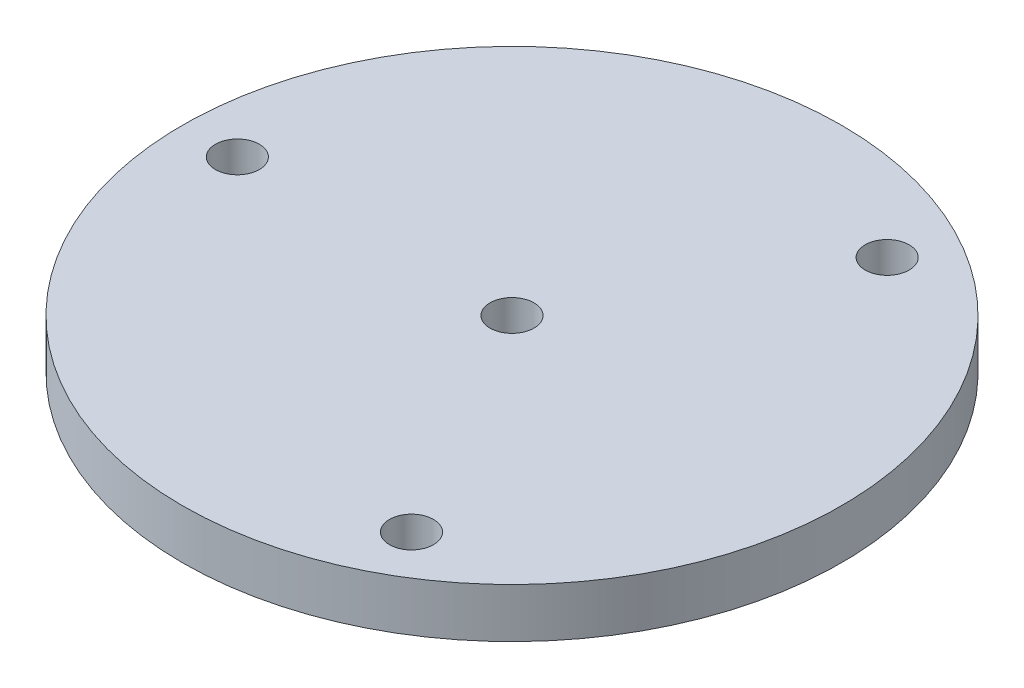
ISO-10303-21;
HEADER;
FILE_DESCRIPTION(('STEP AP214'),'2;1');
FILE_NAME('part.step','',(''),(''),'','','');
FILE_SCHEMA(('AUTOMOTIVE_DESIGN { 1 0 10303 214 1 1 1 1 }'));
ENDSEC;
DATA;
#1=APPLICATION_CONTEXT('core data for automotive mechanical design processes');
#2=APPLICATION_PROTOCOL_DEFINITION('international standard','automotive_design',2000,#1);
#3=PRODUCT_CONTEXT('',#1,'mechanical');
#4=PRODUCT('Part','Part','',(#3));
#5=PRODUCT_RELATED_PRODUCT_CATEGORY('part','',(#4));
#6=PRODUCT_DEFINITION_FORMATION('','',#4);
#7=PRODUCT_DEFINITION_CONTEXT('part definition',#1,'design');
#8=PRODUCT_DEFINITION('design','',#6,#7);
#9=PRODUCT_DEFINITION_SHAPE('','',#8);
#10=(LENGTH_UNIT() NAMED_UNIT(*) SI_UNIT(.MILLI.,.METRE.));
#11=(NAMED_UNIT(*) PLANE_ANGLE_UNIT() SI_UNIT($,.RADIAN.));
#12=(NAMED_UNIT(*) SI_UNIT($,.STERADIAN.) SOLID_ANGLE_UNIT());
#13=UNCERTAINTY_MEASURE_WITH_UNIT(LENGTH_MEASURE(1.E-05),#10,'distance_accuracy_value','');
#14=(GEOMETRIC_REPRESENTATION_CONTEXT(3) GLOBAL_UNCERTAINTY_ASSIGNED_CONTEXT((#13)) GLOBAL_UNIT_ASSIGNED_CONTEXT((#10,
#11,#12)) REPRESENTATION_CONTEXT('',''));
#15=CARTESIAN_POINT('',(0.,0.,0.));
#16=DIRECTION('',(0.,0.,1.));
#17=DIRECTION('',(1.,0.,0.));
#18=AXIS2_PLACEMENT_3D('',#15,#16,#17);
#19=CARTESIAN_POINT('',(0.,9.,0.));
#20=DIRECTION('',(0.,1.,0.));
#21=DIRECTION('',(0.,0.,1.));
#22=AXIS2_PLACEMENT_3D('',#19,#20,#21);
#23=PLANE('',#22);
#24=CARTESIAN_POINT('',(25.0000000000002,9.,-43.3012701892218));
#25=DIRECTION('',(0.,1.,0.));
#26=DIRECTION('',(0.,0.,1.));
#27=AXIS2_PLACEMENT_3D('',#24,#25,#26);
#28=CIRCLE('',#27,4.00000000000001);
#29=CARTESIAN_POINT('',(25.0000000000002,9.,-39.3012701892218));
#30=VERTEX_POINT('',#29);
#31=EDGE_CURVE('E64',#30,#30,#28,.T.);
#32=ORIENTED_EDGE('',*,*,#31,.F.);
#33=EDGE_LOOP('',(#32));
#34=FACE_BOUND('',#33,.T.);
#35=CARTESIAN_POINT('',(0.,9.,0.));
#36=DIRECTION('',(0.,1.,0.));
#37=DIRECTION('',(0.,0.,1.));
#38=AXIS2_PLACEMENT_3D('',#35,#36,#37);
#39=CIRCLE('',#38,4.);
#40=CARTESIAN_POINT('',(0.,9.,4.));
#41=VERTEX_POINT('',#40);
#42=EDGE_CURVE('E50',#41,#41,#39,.T.);
#43=ORIENTED_EDGE('',*,*,#42,.F.);
#44=EDGE_LOOP('',(#43));
#45=FACE_BOUND('',#44,.T.);
#46=CARTESIAN_POINT('',(0.,9.,0.));
#47=DIRECTION('',(0.,1.,0.));
#48=DIRECTION('',(0.,0.,1.));
#49=AXIS2_PLACEMENT_3D('',#46,#47,#48);
#50=CIRCLE('',#49,60.);
#51=CARTESIAN_POINT('',(0.,9.,60.));
#52=VERTEX_POINT('',#51);
#53=EDGE_CURVE('E10',#52,#52,#50,.T.);
#54=ORIENTED_EDGE('',*,*,#53,.T.);
#55=EDGE_LOOP('',(#54));
#56=FACE_BOUND('',#55,.T.);
#57=CARTESIAN_POINT('',(-50.,9.,0.));
#58=DIRECTION('',(0.,1.,0.));
#59=DIRECTION('',(0.,0.,1.));
#60=AXIS2_PLACEMENT_3D('',#57,#58,#59);
#61=CIRCLE('',#60,4.00000000000001);
#62=CARTESIAN_POINT('',(-50.,9.,4.00000000000001));
#63=VERTEX_POINT('',#62);
#64=EDGE_CURVE('E56',#63,#63,#61,.T.);
#65=ORIENTED_EDGE('',*,*,#64,.F.);
#66=EDGE_LOOP('',(#65));
#67=FACE_BOUND('',#66,.T.);
#68=CARTESIAN_POINT('',(24.9999999999996,9.,43.3012701892222));
#69=DIRECTION('',(0.,1.,0.));
#70=DIRECTION('',(0.,0.,1.));
#71=AXIS2_PLACEMENT_3D('',#68,#69,#70);
#72=CIRCLE('',#71,4.00000000000001);
#73=CARTESIAN_POINT('',(24.9999999999996,9.,47.3012701892222));
#74=VERTEX_POINT('',#73);
#75=EDGE_CURVE('E72',#74,#74,#72,.T.);
#76=ORIENTED_EDGE('',*,*,#75,.F.);
#77=EDGE_LOOP('',(#76));
#78=FACE_BOUND('',#77,.T.);
#79=ADVANCED_FACE('F37',(#34,#45,#56,#67,#78),#23,.T.);
#80=CARTESIAN_POINT('',(0.,0.,0.));
#81=DIRECTION('',(0.,1.,0.));
#82=DIRECTION('',(0.,0.,1.));
#83=AXIS2_PLACEMENT_3D('',#80,#81,#82);
#84=PLANE('',#83);
#85=CARTESIAN_POINT('',(0.,0.,0.));
#86=DIRECTION('',(0.,1.,0.));
#87=DIRECTION('',(0.,0.,1.));
#88=AXIS2_PLACEMENT_3D('',#85,#86,#87);
#89=CIRCLE('',#88,60.);
#90=CARTESIAN_POINT('',(0.,0.,60.));
#91=VERTEX_POINT('',#90);
#92=EDGE_CURVE('E41',#91,#91,#89,.T.);
#93=ORIENTED_EDGE('',*,*,#92,.F.);
#94=EDGE_LOOP('',(#93));
#95=FACE_BOUND('',#94,.T.);
#96=CARTESIAN_POINT('',(0.,0.,0.));
#97=DIRECTION('',(0.,1.,0.));
#98=DIRECTION('',(0.,0.,1.));
#99=AXIS2_PLACEMENT_3D('',#96,#97,#98);
#100=CIRCLE('',#99,4.);
#101=CARTESIAN_POINT('',(0.,0.,4.));
#102=VERTEX_POINT('',#101);
#103=EDGE_CURVE('E52',#102,#102,#100,.T.);
#104=ORIENTED_EDGE('',*,*,#103,.T.);
#105=EDGE_LOOP('',(#104));
#106=FACE_BOUND('',#105,.T.);
#107=CARTESIAN_POINT('',(-50.,0.,0.));
#108=DIRECTION('',(0.,1.,0.));
#109=DIRECTION('',(0.,0.,1.));
#110=AXIS2_PLACEMENT_3D('',#107,#108,#109);
#111=CIRCLE('',#110,4.00000000000001);
#112=CARTESIAN_POINT('',(-50.,0.,4.00000000000001));
#113=VERTEX_POINT('',#112);
#114=EDGE_CURVE('E60',#113,#113,#111,.T.);
#115=ORIENTED_EDGE('',*,*,#114,.T.);
#116=EDGE_LOOP('',(#115));
#117=FACE_BOUND('',#116,.T.);
#118=CARTESIAN_POINT('',(25.0000000000002,0.,-43.3012701892218));
#119=DIRECTION('',(0.,1.,0.));
#120=DIRECTION('',(0.,0.,1.));
#121=AXIS2_PLACEMENT_3D('',#118,#119,#120);
#122=CIRCLE('',#121,4.00000000000001);
#123=CARTESIAN_POINT('',(25.0000000000002,0.,-39.3012701892218));
#124=VERTEX_POINT('',#123);
#125=EDGE_CURVE('E68',#124,#124,#122,.T.);
#126=ORIENTED_EDGE('',*,*,#125,.T.);
#127=EDGE_LOOP('',(#126));
#128=FACE_BOUND('',#127,.T.);
#129=CARTESIAN_POINT('',(24.9999999999996,0.,43.3012701892222));
#130=DIRECTION('',(0.,1.,0.));
#131=DIRECTION('',(0.,0.,1.));
#132=AXIS2_PLACEMENT_3D('',#129,#130,#131);
#133=CIRCLE('',#132,4.00000000000001);
#134=CARTESIAN_POINT('',(24.9999999999996,0.,47.3012701892222));
#135=VERTEX_POINT('',#134);
#136=EDGE_CURVE('E76',#135,#135,#133,.T.);
#137=ORIENTED_EDGE('',*,*,#136,.T.);
#138=EDGE_LOOP('',(#137));
#139=FACE_BOUND('',#138,.T.);
#140=ADVANCED_FACE('F88',(#95,#106,#117,#128,#139),#84,.F.);
#141=CARTESIAN_POINT('',(0.,9.,0.));
#142=DIRECTION('',(0.,-1.,0.));
#143=DIRECTION('',(0.,0.,-1.));
#144=AXIS2_PLACEMENT_3D('',#141,#142,#143);
#145=CYLINDRICAL_SURFACE('',#144,60.);
#146=ORIENTED_EDGE('',*,*,#53,.F.);
#147=EDGE_LOOP('',(#146));
#148=FACE_BOUND('',#147,.T.);
#149=ORIENTED_EDGE('',*,*,#92,.T.);
#150=EDGE_LOOP('',(#149));
#151=FACE_BOUND('',#150,.T.);
#152=ADVANCED_FACE('F39',(#148,#151),#145,.T.);
#153=CARTESIAN_POINT('',(0.,9.,0.));
#154=DIRECTION('',(0.,-1.,0.));
#155=DIRECTION('',(0.,0.,-1.));
#156=AXIS2_PLACEMENT_3D('',#153,#154,#155);
#157=CYLINDRICAL_SURFACE('',#156,4.);
#158=ORIENTED_EDGE('',*,*,#42,.T.);
#159=EDGE_LOOP('',(#158));
#160=FACE_BOUND('',#159,.T.);
#161=ORIENTED_EDGE('',*,*,#103,.F.);
#162=EDGE_LOOP('',(#161));
#163=FACE_BOUND('',#162,.T.);
#164=ADVANCED_FACE('F98',(#160,#163),#157,.F.);
#165=CARTESIAN_POINT('',(-50.,9.,0.));
#166=DIRECTION('',(0.,-1.,0.));
#167=DIRECTION('',(0.,0.,-1.));
#168=AXIS2_PLACEMENT_3D('',#165,#166,#167);
#169=CYLINDRICAL_SURFACE('',#168,4.00000000000001);
#170=ORIENTED_EDGE('',*,*,#64,.T.);
#171=EDGE_LOOP('',(#170));
#172=FACE_BOUND('',#171,.T.);
#173=ORIENTED_EDGE('',*,*,#114,.F.);
#174=EDGE_LOOP('',(#173));
#175=FACE_BOUND('',#174,.T.);
#176=ADVANCED_FACE('F101',(#172,#175),#169,.F.);
#177=CARTESIAN_POINT('',(25.0000000000002,9.,-43.3012701892218));
#178=DIRECTION('',(0.,-1.,0.));
#179=DIRECTION('',(0.,0.,-1.));
#180=AXIS2_PLACEMENT_3D('',#177,#178,#179);
#181=CYLINDRICAL_SURFACE('',#180,4.00000000000001);
#182=ORIENTED_EDGE('',*,*,#31,.T.);
#183=EDGE_LOOP('',(#182));
#184=FACE_BOUND('',#183,.T.);
#185=ORIENTED_EDGE('',*,*,#125,.F.);
#186=EDGE_LOOP('',(#185));
#187=FACE_BOUND('',#186,.T.);
#188=ADVANCED_FACE('F105',(#184,#187),#181,.F.);
#189=CARTESIAN_POINT('',(24.9999999999996,9.,43.3012701892222));
#190=DIRECTION('',(0.,-1.,0.));
#191=DIRECTION('',(0.,0.,-1.));
#192=AXIS2_PLACEMENT_3D('',#189,#190,#191);
#193=CYLINDRICAL_SURFACE('',#192,4.00000000000001);
#194=ORIENTED_EDGE('',*,*,#75,.T.);
#195=EDGE_LOOP('',(#194));
#196=FACE_BOUND('',#195,.T.);
#197=ORIENTED_EDGE('',*,*,#136,.F.);
#198=EDGE_LOOP('',(#197));
#199=FACE_BOUND('',#198,.T.);
#200=ADVANCED_FACE('F84',(#196,#199),#193,.F.);
#201=CLOSED_SHELL('',(#79,#140,#152,#164,#176,#188,#200));
#202=MANIFOLD_SOLID_BREP('B2',#201);
#203=ADVANCED_BREP_SHAPE_REPRESENTATION('',(#18,#202),#14);
#204=SHAPE_DEFINITION_REPRESENTATION(#9,#203);
ENDSEC;
END-ISO-10303-21;
